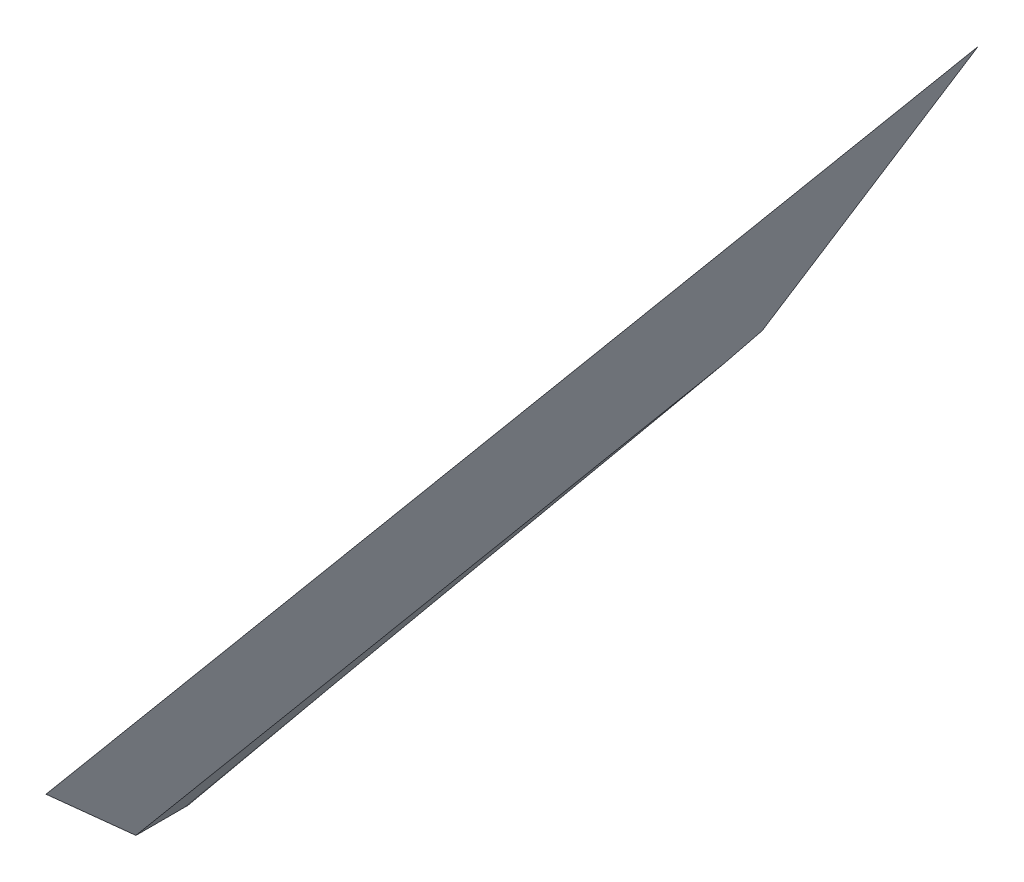
ISO-10303-21;
HEADER;
FILE_DESCRIPTION(('STEP AP214'),'2;1');
FILE_NAME('part.step','',(''),(''),'','','');
FILE_SCHEMA(('AUTOMOTIVE_DESIGN { 1 0 10303 214 1 1 1 1 }'));
ENDSEC;
DATA;
#1=APPLICATION_CONTEXT('core data for automotive mechanical design processes');
#2=APPLICATION_PROTOCOL_DEFINITION('international standard','automotive_design',2000,#1);
#3=PRODUCT_CONTEXT('',#1,'mechanical');
#4=PRODUCT('Part','Part','',(#3));
#5=PRODUCT_RELATED_PRODUCT_CATEGORY('part','',(#4));
#6=PRODUCT_DEFINITION_FORMATION('','',#4);
#7=PRODUCT_DEFINITION_CONTEXT('part definition',#1,'design');
#8=PRODUCT_DEFINITION('design','',#6,#7);
#9=PRODUCT_DEFINITION_SHAPE('','',#8);
#10=(LENGTH_UNIT() NAMED_UNIT(*) SI_UNIT(.MILLI.,.METRE.));
#11=(NAMED_UNIT(*) PLANE_ANGLE_UNIT() SI_UNIT($,.RADIAN.));
#12=(NAMED_UNIT(*) SI_UNIT($,.STERADIAN.) SOLID_ANGLE_UNIT());
#13=UNCERTAINTY_MEASURE_WITH_UNIT(LENGTH_MEASURE(1.E-05),#10,'distance_accuracy_value','');
#14=(GEOMETRIC_REPRESENTATION_CONTEXT(3) GLOBAL_UNCERTAINTY_ASSIGNED_CONTEXT((#13)) GLOBAL_UNIT_ASSIGNED_CONTEXT((#10,
#11,#12)) REPRESENTATION_CONTEXT('',''));
#15=CARTESIAN_POINT('',(0.,0.,0.));
#16=DIRECTION('',(0.,0.,1.));
#17=DIRECTION('',(1.,0.,0.));
#18=AXIS2_PLACEMENT_3D('',#15,#16,#17);
#19=CARTESIAN_POINT('',(125.373540665109,304.904026269313,170.043614927809));
#20=DIRECTION('',(-0.573127406974546,0.259388760360703,-0.777330332852881));
#21=DIRECTION('',(-0.804878930909392,0.,0.593439050432438));
#22=AXIS2_PLACEMENT_3D('',#19,#20,#21);
#23=PLANE('',#22);
#24=CARTESIAN_POINT('',(171.924414734314,139.918657355713,80.6672852883179));
#25=CARTESIAN_POINT('',(173.665506575997,142.211538755921,80.1486900766855));
#26=CARTESIAN_POINT('',(175.405442248545,144.505577520852,79.631333514284));
#27=CARTESIAN_POINT('',(178.883217977308,149.095746072393,78.5988632489228));
#28=CARTESIAN_POINT('',(180.62105803427,151.391875858257,78.0837495451626));
#29=CARTESIAN_POINT('',(184.094848952765,155.985989114493,77.0555336050185));
#30=CARTESIAN_POINT('',(185.830799826776,158.283972572443,76.5424313552888));
#31=CARTESIAN_POINT('',(189.301004711933,162.881624468485,75.5180402207066));
#32=CARTESIAN_POINT('',(191.035258722907,165.181292906748,75.0067513360383));
#33=CARTESIAN_POINT('',(196.235713537649,172.082562590033,73.4753414004066));
#34=CARTESIAN_POINT('',(199.699616289503,176.686440330173,72.4576743560606));
#35=CARTESIAN_POINT('',(206.622358556999,185.899185812328,70.427738525566));
#36=CARTESIAN_POINT('',(210.081198074293,190.508053552712,69.4154697376554));
#37=CARTESIAN_POINT('',(216.99460780353,199.729904940354,67.3954533746809));
#38=CARTESIAN_POINT('',(220.44917805798,204.342888545831,66.3877057543349));
#39=CARTESIAN_POINT('',(227.354748193781,213.57236476622,64.3760138854631));
#40=CARTESIAN_POINT('',(230.805748070725,218.188857385452,63.3720696416293));
#41=CARTESIAN_POINT('',(237.704706271686,227.424823418911,61.367418364647));
#42=CARTESIAN_POINT('',(241.15266459302,232.044296835763,60.3667113343542));
#43=CARTESIAN_POINT('',(248.045968106532,241.285794255005,58.3680750492733));
#44=CARTESIAN_POINT('',(251.491313298386,245.907818257712,57.3701457948301));
#45=CARTESIAN_POINT('',(258.379954149344,255.15434933474,55.3766269917054));
#46=CARTESIAN_POINT('',(261.823249670518,259.778856543397,54.3810375895467));
#47=CARTESIAN_POINT('',(268.707871699028,269.029780850709,52.3919478582082));
#48=CARTESIAN_POINT('',(272.149198207569,273.656197948192,51.3984475277491));
#49=CARTESIAN_POINT('',(279.030128089955,282.910703175008,49.4132749475584));
#50=CARTESIAN_POINT('',(282.469731464315,287.538791303841,48.4216026972805));
#51=CARTESIAN_POINT('',(289.347421759985,296.796437788338,46.4398668836187));
#52=CARTESIAN_POINT('',(292.785508681434,301.425996143867,45.4498033200877));
#53=CARTESIAN_POINT('',(299.660375794562,310.686459682702,43.4710890732212));
#54=CARTESIAN_POINT('',(303.097155972653,315.317364879174,42.4824384042965));
#55=CARTESIAN_POINT('',(309.969523832872,324.580330750287,40.5064018700045));
#56=CARTESIAN_POINT('',(313.405111514844,329.212391425079,39.5190160048018));
#57=CARTESIAN_POINT('',(320.275222994387,338.477543080628,37.5453724834184));
#58=CARTESIAN_POINT('',(323.709746791794,343.110634061545,36.5591148274123));
#59=CARTESIAN_POINT('',(330.577837537534,352.377742077883,34.587614019177));
#60=CARTESIAN_POINT('',(334.011404485729,357.011759113439,33.6023708670949));
#61=CARTESIAN_POINT('',(337.444546295139,361.646186737307,32.6175781807508));
#62=B_SPLINE_CURVE_WITH_KNOTS('',3,(#24,#25,#26,#27,#28,#29,#30,#31,#32,#33,#34,#35,#36,#37,#38,
#39,#40,#41,#42,#43,#44,#45,#46,#47,#48,#49,#50,#51,#52,#53,#54,#55,#56,#57,#58,#59,#60,#61),
.UNSPECIFIED.,.F.,.F.,(4,2,2,2,2,2,2,2,2,2,2,2,2,2,2,2,2,2,4),(0.,8.77603526900681,
17.5520674050813,26.3280412137687,35.1040159138626,52.6559189906871,70.2078163381776,
87.7595374990635,105.311280305654,122.863038591689,140.414799057332,157.967630803315,
175.520451797042,193.073267545195,210.626081688443,228.179073601313,245.73206779631,
263.285064706061,280.838064159246),.UNSPECIFIED.);
#63=CARTESIAN_POINT('',(171.924414734314,139.918657355713,80.6672852883179));
#64=VERTEX_POINT('',#63);
#65=CARTESIAN_POINT('',(177.708290416846,147.545094914688,78.9477004074653));
#66=VERTEX_POINT('',#65);
#67=EDGE_CURVE('E112',#64,#66,#62,.T.);
#68=ORIENTED_EDGE('',*,*,#67,.T.);
#69=DIRECTION('',(-0.496730625068711,-0.864411263879176,0.0777936565386454));
#70=VECTOR('',#69,1.);
#71=CARTESIAN_POINT('',(228.841679114316,236.527482792002,70.9396310893358));
#72=LINE('',#71,#70);
#73=CARTESIAN_POINT('',(213.853371212455,210.444810367556,73.2869703073506));
#74=VERTEX_POINT('',#73);
#75=EDGE_CURVE('E11',#74,#66,#72,.T.);
#76=ORIENTED_EDGE('',*,*,#75,.F.);
#77=CARTESIAN_POINT('',(76.9207661918651,38.3711817786628,116.828129329232));
#78=CARTESIAN_POINT('',(78.870188885859,40.8177287860045,116.207208264006));
#79=CARTESIAN_POINT('',(80.8194476616511,43.2644519711509,115.586466845129));
#80=CARTESIAN_POINT('',(84.7176953712788,48.1581882589645,114.345279705558));
#81=CARTESIAN_POINT('',(86.6666843051166,50.6052013616293,113.724833984862));
#82=CARTESIAN_POINT('',(92.513333190501,57.9465817068476,111.863845024378));
#83=CARTESIAN_POINT('',(96.4106754183145,62.8412902281106,110.623649924924));
#84=CARTESIAN_POINT('',(104.204791978514,72.6313168734862,108.143881856067));
#85=CARTESIAN_POINT('',(108.101566310903,77.5266349975948,106.904308886662));
#86=CARTESIAN_POINT('',(115.894713056689,87.3177022717248,104.425603113444));
#87=CARTESIAN_POINT('',(119.7910854701,92.2134514217305,103.186470309616));
#88=CARTESIAN_POINT('',(127.583536721696,102.00526481901,100.708526301012));
#89=CARTESIAN_POINT('',(131.479615559878,106.901329066288,99.469715096239));
#90=CARTESIAN_POINT('',(139.271551821627,116.693695132511,96.9923352119064));
#91=CARTESIAN_POINT('',(143.167409245193,121.589996951459,95.7537665323479));
#92=CARTESIAN_POINT('',(152.470042521118,133.281991898247,92.7964369198038));
#93=CARTESIAN_POINT('',(157.876739514006,140.07776961547,91.0777623568667));
#94=CARTESIAN_POINT('',(168.689897527855,153.669578069907,87.6406716443231));
#95=CARTESIAN_POINT('',(174.096358548818,160.465608807121,85.9222554947154));
#96=CARTESIAN_POINT('',(184.909104345647,174.057859265263,82.4856162037241));
#97=CARTESIAN_POINT('',(190.315389121513,180.854078986192,80.7673930623403));
#98=CARTESIAN_POINT('',(201.127824058467,194.446663417265,77.3310944130648));
#99=CARTESIAN_POINT('',(206.533974219548,201.243028127417,75.6130189051807));
#100=CARTESIAN_POINT('',(217.346169303768,214.835870409057,72.1769831424876));
#101=CARTESIAN_POINT('',(222.752214226906,221.632347980545,70.4590228876788));
#102=CARTESIAN_POINT('',(233.564219124732,235.225394235959,67.023195414219));
#103=CARTESIAN_POINT('',(238.97017909942,242.021962919885,65.3053281955683));
#104=CARTESIAN_POINT('',(244.376106735962,248.818566274687,63.5874963892915));
#105=B_SPLINE_CURVE_WITH_KNOTS('',3,(#77,#78,#79,#80,#81,#82,#83,#84,#85,#86,#87,#88,#89,#90,
#91,#92,#93,#94,#95,#96,#97,#98,#99,#100,#101,#102,#103,#104),.UNSPECIFIED.,.F.,.F.,(4,2,2,2,2,
2,2,2,2,2,2,2,2,4),(0.,9.56778217613013,19.1355642745629,38.2711275270922,57.4066906488929,
76.5422530720067,95.6778156985162,114.813378405217,141.371226281731,167.929074032651,
194.486921738915,221.044770794422,247.602619891668,274.160469052355),.UNSPECIFIED.);
#106=CARTESIAN_POINT('',(76.9207661918495,38.3711817786637,116.828129343839));
#107=VERTEX_POINT('',#106);
#108=EDGE_CURVE('E110',#107,#74,#105,.T.);
#109=ORIENTED_EDGE('',*,*,#108,.F.);
#110=CARTESIAN_POINT('',(76.9207661918264,38.3711817786551,116.828129329258));
#111=CARTESIAN_POINT('',(78.060106148323,37.4627396115297,115.684951705843));
#112=CARTESIAN_POINT('',(79.1995483968771,36.5544546388475,114.54175111676));
#113=CARTESIAN_POINT('',(81.2177369212999,34.9461165383041,112.517046926776));
#114=CARTESIAN_POINT('',(82.0964417150751,34.2459996420327,111.63555263172));
#115=CARTESIAN_POINT('',(83.8539729749667,32.8459528893293,109.872536745977));
#116=CARTESIAN_POINT('',(84.7327994410861,32.1460230329018,108.99101515529));
#117=CARTESIAN_POINT('',(85.6116867373077,31.4461867373069,108.109479934914));
#118=B_SPLINE_CURVE_WITH_KNOTS('',3,(#110,#111,#112,#113,#114,#115,#116,#117),.UNSPECIFIED.,.F.,
.F.,(4,2,2,4),(0.,5.5562541273027,9.84039483802176,14.1245356548903),.UNSPECIFIED.);
#119=CARTESIAN_POINT('',(85.6116867373077,31.4461867373069,108.109479934914));
#120=VERTEX_POINT('',#119);
#121=EDGE_CURVE('E71',#107,#120,#118,.T.);
#122=ORIENTED_EDGE('',*,*,#121,.T.);
#123=CARTESIAN_POINT('',(85.6116867373077,31.4461867373069,108.109479934914));
#124=CARTESIAN_POINT('',(88.010175368803,34.4583313315158,107.346196820089));
#125=CARTESIAN_POINT('',(90.4085032206406,37.4706485645732,106.583089856637));
#126=CARTESIAN_POINT('',(95.2049028319418,43.4955579366349,105.057156481079));
#127=CARTESIAN_POINT('',(97.6029745914068,46.5081500756378,104.294330068971));
#128=CARTESIAN_POINT('',(104.796903853723,55.54623319602,102.006164057349));
#129=CARTESIAN_POINT('',(109.592475455651,61.5720310254054,100.481137645895));
#130=CARTESIAN_POINT('',(119.183142648748,73.6241373487767,97.4316061913833));
#131=CARTESIAN_POINT('',(123.978238239918,79.6504458427614,95.9071011483249));
#132=CARTESIAN_POINT('',(133.568109028747,91.7034064081565,92.8584419380367));
#133=CARTESIAN_POINT('',(138.362884226409,97.730058479564,91.334287770804));
#134=CARTESIAN_POINT('',(147.952211224536,109.783602331242,88.2862241364778));
#135=CARTESIAN_POINT('',(152.746763024999,115.810494111515,86.7623146693869));
#136=CARTESIAN_POINT('',(162.33569983702,127.864456677606,83.714678441724));
#137=CARTESIAN_POINT('',(167.130084848576,133.891527463425,82.1909516811542));
#138=CARTESIAN_POINT('',(171.924414734314,139.918657355713,80.6672852883179));
#139=B_SPLINE_CURVE_WITH_KNOTS('',3,(#123,#124,#125,#126,#127,#128,#129,#130,#131,#132,#133,
#134,#135,#136,#137,#138),.UNSPECIFIED.,.F.,.F.,(4,2,2,2,2,2,2,4),(0.,11.7760466247532,
23.5520931886116,47.1041857509119,70.6562782599662,94.2083705670895,117.760463123086,
141.312555977967),.UNSPECIFIED.);
#140=EDGE_CURVE('E115',#120,#64,#139,.T.);
#141=ORIENTED_EDGE('',*,*,#140,.T.);
#142=EDGE_LOOP('',(#68,#76,#109,#122,#141));
#143=FACE_BOUND('',#142,.T.);
#144=ADVANCED_FACE('F38',(#143),#23,.F.);
#145=CARTESIAN_POINT('',(48.9977785016991,346.433963694555,143.830238777529));
#146=DIRECTION('',(-0.320862040401468,0.0996172698803115,-0.941872576610552));
#147=DIRECTION('',(-0.94658103293114,0.,0.322466041770318));
#148=AXIS2_PLACEMENT_3D('',#145,#146,#147);
#149=PLANE('',#148);
#150=CARTESIAN_POINT('',(85.6116867373077,31.4461867373069,98.0424785638344));
#151=CARTESIAN_POINT('',(87.2131690050096,33.4802214644686,97.7120412101533));
#152=CARTESIAN_POINT('',(88.815466812221,35.5135565698957,97.381252035975));
#153=CARTESIAN_POINT('',(92.0214558864337,39.5790294634869,96.7190723516814));
#154=CARTESIAN_POINT('',(93.6251471532035,41.6111672518498,96.3876818416661));
#155=CARTESIAN_POINT('',(96.8336840435654,45.6744455601531,95.7244020976523));
#156=CARTESIAN_POINT('',(98.4385296657043,47.7055860813434,95.3925128642812));
#157=CARTESIAN_POINT('',(101.649204107663,51.7670205741813,94.7283099221076));
#158=CARTESIAN_POINT('',(103.255032927529,53.7973145457883,94.3959962132848));
#159=CARTESIAN_POINT('',(108.073770046511,59.8871166153831,93.3985148222761));
#160=CARTESIAN_POINT('',(111.287929835593,63.9455459196525,92.7328067038128));
#161=CARTESIAN_POINT('',(117.718728182269,72.0602529433271,91.4003184771527));
#162=CARTESIAN_POINT('',(120.935366735887,76.116530666165,90.7335383706731));
#163=CARTESIAN_POINT('',(127.37055309952,84.2274373784788,89.3991533643836));
#164=CARTESIAN_POINT('',(130.589100910064,88.2820663674969,88.7315484643449));
#165=CARTESIAN_POINT('',(137.027693388977,96.3900296235508,87.3956918023243));
#166=CARTESIAN_POINT('',(140.247738057485,100.443363890467,86.7274400402827));
#167=CARTESIAN_POINT('',(148.299316507231,110.575383767205,85.0561717918653));
#168=CARTESIAN_POINT('',(153.131594392911,116.653424990918,84.0528336623481));
#169=CARTESIAN_POINT('',(162.798110625394,128.807807005573,82.0453096983841));
#170=CARTESIAN_POINT('',(167.632348971989,134.884147796695,81.0411238640274));
#171=CARTESIAN_POINT('',(177.302314240629,147.035543407758,79.0321090804067));
#172=CARTESIAN_POINT('',(182.13804116341,153.110598227059,78.0272801308244));
#173=CARTESIAN_POINT('',(191.810646679173,165.259708814939,76.0171242344072));
#174=CARTESIAN_POINT('',(196.647525272187,171.333764583488,75.0117972875575));
#175=CARTESIAN_POINT('',(207.601148383944,185.086922276209,72.7348971068959));
#176=CARTESIAN_POINT('',(213.718164782186,192.765788193395,71.4632062922292));
#177=CARTESIAN_POINT('',(225.953303280977,208.122559883884,68.9193464402341));
#178=CARTESIAN_POINT('',(232.071425381531,215.800465657185,67.6471774029037));
#179=CARTESIAN_POINT('',(250.427066721103,238.833069841581,63.8301182005357));
#180=CARTESIAN_POINT('',(262.665863632501,254.186658424454,61.284675397448));
#181=CARTESIAN_POINT('',(287.145624172898,284.891956756862,56.1928529536366));
#182=CARTESIAN_POINT('',(299.386587802242,300.2436665061,53.6464733127638));
#183=CARTESIAN_POINT('',(317.749149059721,323.27026375885,49.8264214198984));
#184=CARTESIAN_POINT('',(323.870189378005,330.945635696248,48.5529902594956));
#185=CARTESIAN_POINT('',(336.112585769803,346.296105073702,46.0059913400183));
#186=CARTESIAN_POINT('',(342.233941843315,353.971202513758,44.7324235809439));
#187=CARTESIAN_POINT('',(348.355427906917,361.64618694067,43.4587995860821));
#188=B_SPLINE_CURVE_WITH_KNOTS('',3,(#150,#151,#152,#153,#154,#155,#156,#157,#158,#159,#160,
#161,#162,#163,#164,#165,#166,#167,#168,#169,#170,#171,#172,#173,#174,#175,#176,#177,#178,#179,
#180,#181,#182,#183,#184,#185,#186,#187),.UNSPECIFIED.,.F.,.F.,(4,2,2,2,2,2,2,2,2,2,2,2,2,2,2,2,
2,2,4),(0.,7.8295002371344,15.6589991735866,23.4884882711674,31.3179777445532,46.9769526385144,
62.6359024726599,78.2948566521888,93.9538122749013,117.442141397294,140.930468022424,
164.418806282897,187.907145234399,217.605640319198,247.304135524156,306.701113143207,
366.098100217514,395.796599546118,425.495098850916),.UNSPECIFIED.);
#189=CARTESIAN_POINT('',(85.6116867373077,31.4461867373068,98.0424785638344));
#190=VERTEX_POINT('',#189);
#191=EDGE_CURVE('E158',#190,#66,#188,.T.);
#192=ORIENTED_EDGE('',*,*,#191,.F.);
#193=CARTESIAN_POINT('',(83.6631971944158,32.9966211190621,98.8702406093947));
#194=CARTESIAN_POINT('',(84.001122121811,32.7248846091113,98.7263815202573));
#195=CARTESIAN_POINT('',(84.3397359552463,32.4540866109437,98.5823870074764));
#196=CARTESIAN_POINT('',(85.0183414341969,31.9143676381748,98.2941271346276));
#197=CARTESIAN_POINT('',(85.3583330797123,31.6454466635735,98.1498617745597));
#198=CARTESIAN_POINT('',(85.6990136312677,31.3774642007553,98.0054609908482));
#199=B_SPLINE_CURVE_WITH_KNOTS('',3,(#193,#194,#195,#196,#197,#198),.UNSPECIFIED.,.F.,.F.,(4,2,
4),(0.,1.37059393455787,2.74118786911573),.UNSPECIFIED.);
#200=CARTESIAN_POINT('',(83.6631971944156,32.9966211190616,98.8702406093947));
#201=VERTEX_POINT('',#200);
#202=EDGE_CURVE('E107',#201,#190,#199,.T.);
#203=ORIENTED_EDGE('',*,*,#202,.F.);
#204=CARTESIAN_POINT('',(76.9168605088788,38.3662772776607,101.736396716843));
#205=CARTESIAN_POINT('',(78.0411586844725,37.4712103424666,101.258721985922));
#206=CARTESIAN_POINT('',(79.1655024931115,36.5762055306692,100.781038279429));
#207=CARTESIAN_POINT('',(81.4142813882895,34.7863201444682,99.8256529102799));
#208=CARTESIAN_POINT('',(82.5387164748294,33.8914395700658,99.3479512476238));
#209=CARTESIAN_POINT('',(83.6631971944156,32.9966211190615,98.8702406093947));
#210=B_SPLINE_CURVE_WITH_KNOTS('',3,(#204,#205,#206,#207,#208,#209),.UNSPECIFIED.,.F.,.F.,(4,2,
4),(0.,4.54315738551166,9.08631481874065),.UNSPECIFIED.);
#211=CARTESIAN_POINT('',(76.9168605079251,38.3662772779609,101.73639672314));
#212=VERTEX_POINT('',#211);
#213=EDGE_CURVE('E95',#212,#201,#210,.T.);
#214=ORIENTED_EDGE('',*,*,#213,.F.);
#215=CARTESIAN_POINT('',(76.9168605079251,38.3662772779602,101.736396720365));
#216=CARTESIAN_POINT('',(82.8257347122653,45.7905850958167,100.508689080468));
#217=CARTESIAN_POINT('',(88.7344669034671,53.215016088025,99.2810428468799));
#218=CARTESIAN_POINT('',(100.551741040938,68.0640430733313,96.8258326406341));
#219=CARTESIAN_POINT('',(106.460282987208,75.4886390664292,95.5982686679768));
#220=CARTESIAN_POINT('',(124.185764132161,97.7625525272532,91.9156393135562));
#221=CARTESIAN_POINT('',(136.00255864062,112.611995481073,89.4606364945897));
#222=CARTESIAN_POINT('',(159.635983670446,142.311023570843,84.5507017590594));
#223=CARTESIAN_POINT('',(171.452614191813,157.160608706793,82.0957698424956));
#224=CARTESIAN_POINT('',(195.085787775342,186.859854830213,77.1859438260122));
#225=CARTESIAN_POINT('',(206.902330837505,201.709515817683,74.7310497260926));
#226=CARTESIAN_POINT('',(238.878909847789,241.894111429096,68.0879104781471));
#227=CARTESIAN_POINT('',(259.038899469027,267.229086228659,63.8996853611998));
#228=CARTESIAN_POINT('',(299.35880387883,317.899100708815,55.5232674822507));
#229=CARTESIAN_POINT('',(319.518718667394,343.234140389407,51.3350747202489));
#230=CARTESIAN_POINT('',(339.678629202638,368.569183758141,47.1468837972767));
#231=B_SPLINE_CURVE_WITH_KNOTS('',3,(#215,#216,#217,#218,#219,#220,#221,#222,#223,#224,#225,
#226,#227,#228,#229,#230),.UNSPECIFIED.,.F.,.F.,(4,2,2,2,2,2,2,4),(0.,28.7033388719615,
57.4066777355721,114.813355445152,172.220033076604,229.626710717725,327.567745188632,
425.508779625291),.UNSPECIFIED.);
#232=EDGE_CURVE('E105',#212,#74,#231,.T.);
#233=ORIENTED_EDGE('',*,*,#232,.T.);
#234=ORIENTED_EDGE('',*,*,#75,.T.);
#235=EDGE_LOOP('',(#192,#203,#214,#233,#234));
#236=FACE_BOUND('',#235,.T.);
#237=ADVANCED_FACE('F104',(#236),#149,.T.);
#238=CARTESIAN_POINT('',(85.6116867373077,31.4461867373069,196.277230001507));
#239=CARTESIAN_POINT('',(85.6116867373077,31.4461867373069,163.808233537469));
#240=CARTESIAN_POINT('',(85.6116867373077,31.4461867373069,131.339237073432));
#241=CARTESIAN_POINT('',(85.6116867373077,31.4461867373069,98.8702406093947));
#242=CARTESIAN_POINT('',(76.9413148748088,38.3968923141521,196.277230001507));
#243=CARTESIAN_POINT('',(76.9329214572068,38.3864222904974,163.808233537469));
#244=CARTESIAN_POINT('',(76.9245226279307,38.3759066566038,131.339237073432));
#245=CARTESIAN_POINT('',(76.9161186737156,38.365345089407,98.8702406093947));
#246=B_SPLINE_SURFACE_WITH_KNOTS('',1,3,((#238,#239,#240,#241),(#242,#243,#244,#245)),
.UNSPECIFIED.,.F.,.F.,.F.,(2,2),(4,4),(0.,1.),(-0.048703494696056,0.0487034946960561),.UNSPECIFIED.);
#247=CARTESIAN_POINT('',(76.9413148748088,38.3968923141521,196.277230001507));
#248=CARTESIAN_POINT('',(76.9329214572068,38.3864222904974,163.808233537469));
#249=CARTESIAN_POINT('',(76.9245226279307,38.3759066566038,131.339237073432));
#250=CARTESIAN_POINT('',(76.9161186737156,38.365345089407,98.8702406093947));
#251=B_SPLINE_CURVE_WITH_KNOTS('',3,(#247,#248,#249,#250),.UNSPECIFIED.,.F.,.F.,(4,4),
(-0.048703494696056,0.0487034946960561),.UNSPECIFIED.);
#252=EDGE_CURVE('E56',#107,#212,#251,.T.);
#253=CARTESIAN_POINT('',(76.9161186737156,38.365345089407,98.8702406093947));
#254=CARTESIAN_POINT('',(85.6116867373077,31.4461867373069,98.8702406093947));
#255=B_SPLINE_CURVE_WITH_KNOTS('',1,(#253,#254),.UNSPECIFIED.,.F.,.F.,(2,2),(0.,1.),.UNSPECIFIED.);
#256=CARTESIAN_POINT('',(85.6116867373077,31.4461867373069,98.8702406093947));
#257=VERTEX_POINT('',#256);
#258=EDGE_CURVE('E64',#201,#257,#255,.T.);
#259=CARTESIAN_POINT('',(85.6116867373077,31.4461867373069,196.277230001507));
#260=CARTESIAN_POINT('',(85.6116867373077,31.4461867373069,180.042731769488));
#261=CARTESIAN_POINT('',(85.6116867373077,31.4461867373069,163.808233537469));
#262=CARTESIAN_POINT('',(85.6116867373077,31.4461867373069,131.339237073432));
#263=CARTESIAN_POINT('',(85.6116867373077,31.4461867373069,115.104738841413));
#264=CARTESIAN_POINT('',(85.6116867373077,31.4461867373069,98.8702406093947));
#265=B_SPLINE_CURVE_WITH_KNOTS('',3,(#259,#260,#261,#262,#263,#264),.UNSPECIFIED.,.F.,.F.,(4,2,
4),(0.,0.5,1.),.UNSPECIFIED.);
#266=EDGE_CURVE('E258',#120,#257,#265,.T.);
#267=ORIENTED_EDGE('',*,*,#121,.F.);
#268=ORIENTED_EDGE('',*,*,#252,.T.);
#269=ORIENTED_EDGE('',*,*,#213,.T.);
#270=ORIENTED_EDGE('',*,*,#258,.T.);
#271=ORIENTED_EDGE('',*,*,#266,.F.);
#272=EDGE_LOOP('',(#267,#268,#269,#270,#271));
#273=FACE_BOUND('',#272,.T.);
#274=ADVANCED_FACE('F94',(#273),#246,.T.);
#275=CARTESIAN_POINT('',(85.6116867373077,31.4461867373069,196.277230001507));
#276=CARTESIAN_POINT('',(350.320400258716,361.646186737307,502.336811715639));
#277=CARTESIAN_POINT('',(85.6116867373077,31.4461867373069,180.042731769488));
#278=CARTESIAN_POINT('',(349.992904928856,361.646186737307,425.857143121575));
#279=CARTESIAN_POINT('',(85.6116867373077,31.4461867373069,163.808233537469));
#280=CARTESIAN_POINT('',(349.665409598995,361.646186737307,349.377474527511));
#281=CARTESIAN_POINT('',(85.6116867373077,31.4461867373069,131.339237073432));
#282=CARTESIAN_POINT('',(349.010418939275,361.646186737307,196.418137339381));
#283=CARTESIAN_POINT('',(85.6116867373077,31.4461867373069,115.104738841413));
#284=CARTESIAN_POINT('',(348.682923609414,361.646186737307,119.938468745316));
#285=CARTESIAN_POINT('',(85.6116867373077,31.4461867373069,98.8702406093947));
#286=CARTESIAN_POINT('',(348.355428279554,361.646186737307,43.4588001512512));
#287=B_SPLINE_SURFACE_WITH_KNOTS('',3,1,((#275,#276),(#277,#278),(#279,#280),(#281,#282),(#283,
#284),(#285,#286)),.UNSPECIFIED.,.F.,.F.,.F.,(4,2,4),(2,2),(0.,0.5,1.),(0.,1.),.UNSPECIFIED.);
#288=OFFSET_SURFACE('',#287,-11.1125,.F.);
#289=ORIENTED_EDGE('',*,*,#252,.F.);
#290=ORIENTED_EDGE('',*,*,#108,.T.);
#291=ORIENTED_EDGE('',*,*,#232,.F.);
#292=EDGE_LOOP('',(#289,#290,#291));
#293=FACE_BOUND('',#292,.T.);
#294=ADVANCED_FACE('F109',(#293),#288,.F.);
#295=CARTESIAN_POINT('',(85.6986424179436,31.3769951537859,98.8702406093947));
#296=CARTESIAN_POINT('',(85.7027247971248,31.3821256341456,89.3492268798434));
#297=CARTESIAN_POINT('',(85.7069644966226,31.3883635709842,79.828212256753));
#298=CARTESIAN_POINT('',(85.7108154236448,31.3959645393255,70.3072000000032));
#299=CARTESIAN_POINT('',(85.6116867373077,31.4461867373069,98.8702406093947));
#300=CARTESIAN_POINT('',(85.6116867373077,31.4461867373069,89.3492270729307));
#301=CARTESIAN_POINT('',(85.6116867373077,31.4461867373069,79.8282135364671));
#302=CARTESIAN_POINT('',(85.6116867373077,31.4461867373069,70.3072000000032));
#303=CARTESIAN_POINT('',(76.9161186737156,38.365345089407,98.8702406093947));
#304=CARTESIAN_POINT('',(76.5078807556021,37.8522970534392,89.3492463816686));
#305=CARTESIAN_POINT('',(76.0839108058149,37.2285033695762,79.8283415078823));
#306=CARTESIAN_POINT('',(75.6988181035992,36.4684065354477,70.3072000000032));
#307=B_SPLINE_SURFACE_WITH_KNOTS('',1,3,((#295,#296,#297,#298),(#299,#300,#301,#302),(#303,#304,
#305,#306)),.UNSPECIFIED.,.F.,.F.,.F.,(2,1,2),(4,4),(-0.01,0.,1.),(-0.0142815203046958,
0.0142815203046957),.UNSPECIFIED.);
#308=CARTESIAN_POINT('',(85.6116867373077,31.4461867373069,98.8702406093947));
#309=CARTESIAN_POINT('',(85.6116867373077,31.4461867373069,94.1097338411627));
#310=CARTESIAN_POINT('',(85.6116867373077,31.4461867373069,89.3492270729308));
#311=CARTESIAN_POINT('',(85.6116867373077,31.4461867373069,79.828213536467));
#312=CARTESIAN_POINT('',(85.6116867373077,31.4461867373069,75.0677067682351));
#313=CARTESIAN_POINT('',(85.6116867373077,31.4461867373069,70.3072000000032));
#314=B_SPLINE_CURVE_WITH_KNOTS('',3,(#308,#309,#310,#311,#312,#313),.UNSPECIFIED.,.F.,.F.,(4,2,
4),(0.,0.5,1.),.UNSPECIFIED.);
#315=EDGE_CURVE('E254',#257,#190,#314,.T.);
#316=ORIENTED_EDGE('',*,*,#258,.F.);
#317=ORIENTED_EDGE('',*,*,#202,.T.);
#318=ORIENTED_EDGE('',*,*,#315,.F.);
#319=EDGE_LOOP('',(#316,#317,#318));
#320=FACE_BOUND('',#319,.T.);
#321=ADVANCED_FACE('F40',(#320),#307,.T.);
#322=CARTESIAN_POINT('',(85.6116867373077,31.4461867373069,196.277230001507));
#323=CARTESIAN_POINT('',(350.320400258716,361.646186737307,502.336811715639));
#324=CARTESIAN_POINT('',(85.6116867373077,31.4461867373069,180.042731769488));
#325=CARTESIAN_POINT('',(349.992904928856,361.646186737307,425.857143121575));
#326=CARTESIAN_POINT('',(85.6116867373077,31.4461867373069,163.808233537469));
#327=CARTESIAN_POINT('',(349.665409598995,361.646186737307,349.377474527511));
#328=CARTESIAN_POINT('',(85.6116867373077,31.4461867373069,131.339237073432));
#329=CARTESIAN_POINT('',(349.010418939275,361.646186737307,196.418137339381));
#330=CARTESIAN_POINT('',(85.6116867373077,31.4461867373069,115.104738841413));
#331=CARTESIAN_POINT('',(348.682923609414,361.646186737307,119.938468745316));
#332=CARTESIAN_POINT('',(85.6116867373077,31.4461867373069,98.8702406093947));
#333=CARTESIAN_POINT('',(348.355428279554,361.646186737307,43.4588001512512));
#334=B_SPLINE_SURFACE_WITH_KNOTS('',3,1,((#322,#323),(#324,#325),(#326,#327),(#328,#329),(#330,
#331),(#332,#333)),.UNSPECIFIED.,.F.,.F.,.F.,(4,2,4),(2,2),(0.,0.5,1.),(0.,1.),.UNSPECIFIED.);
#335=DIRECTION('',(0.617346662647269,0.775842906131988,-0.130195557231998));
#336=VECTOR('',#335,1.);
#337=CARTESIAN_POINT('',(216.983557508431,196.546186737307,71.1645203803229));
#338=LINE('',#337,#336);
#339=EDGE_CURVE('E99',#257,#64,#338,.T.);
#340=ORIENTED_EDGE('',*,*,#140,.F.);
#341=ORIENTED_EDGE('',*,*,#266,.T.);
#342=ORIENTED_EDGE('',*,*,#339,.T.);
#343=EDGE_LOOP('',(#340,#341,#342));
#344=FACE_BOUND('',#343,.T.);
#345=ADVANCED_FACE('F139',(#344),#334,.T.);
#346=CARTESIAN_POINT('',(85.6116867373077,31.4461867373069,98.8702406093947));
#347=CARTESIAN_POINT('',(348.355428279554,361.646186737307,43.4588001512512));
#348=CARTESIAN_POINT('',(85.6116867373077,31.4461867373069,94.1097338411627));
#349=CARTESIAN_POINT('',(332.446693014069,361.646186737307,27.6516334593728));
#350=CARTESIAN_POINT('',(85.6116867373077,31.4461867373069,89.3492270729308));
#351=CARTESIAN_POINT('',(316.537957748583,361.646186737307,11.8444667674944));
#352=CARTESIAN_POINT('',(85.6116867373077,31.4461867373069,79.828213536467));
#353=CARTESIAN_POINT('',(284.720487217612,361.646186737307,-19.7698666162626));
#354=CARTESIAN_POINT('',(85.6116867373077,31.4461867373069,75.0677067682351));
#355=CARTESIAN_POINT('',(268.811751952127,361.646186737307,-35.5770333081412));
#356=CARTESIAN_POINT('',(85.6116867373077,31.4461867373069,70.3072000000032));
#357=CARTESIAN_POINT('',(252.903016686641,361.646186737307,-51.3842000000199));
#358=B_SPLINE_SURFACE_WITH_KNOTS('',3,1,((#346,#347),(#348,#349),(#350,#351),(#352,#353),(#354,
#355),(#356,#357)),.UNSPECIFIED.,.F.,.F.,.F.,(4,2,4),(2,2),(0.,0.5,1.),(0.,1.),.UNSPECIFIED.);
#359=ORIENTED_EDGE('',*,*,#67,.F.);
#360=ORIENTED_EDGE('',*,*,#339,.F.);
#361=ORIENTED_EDGE('',*,*,#315,.T.);
#362=ORIENTED_EDGE('',*,*,#191,.T.);
#363=EDGE_LOOP('',(#359,#360,#361,#362));
#364=FACE_BOUND('',#363,.T.);
#365=ADVANCED_FACE('F227',(#364),#358,.T.);
#366=CLOSED_SHELL('',(#144,#237,#274,#294,#321,#345,#365));
#367=MANIFOLD_SOLID_BREP('B2',#366);
#368=ADVANCED_BREP_SHAPE_REPRESENTATION('',(#18,#367),#14);
#369=SHAPE_DEFINITION_REPRESENTATION(#9,#368);
ENDSEC;
END-ISO-10303-21;
